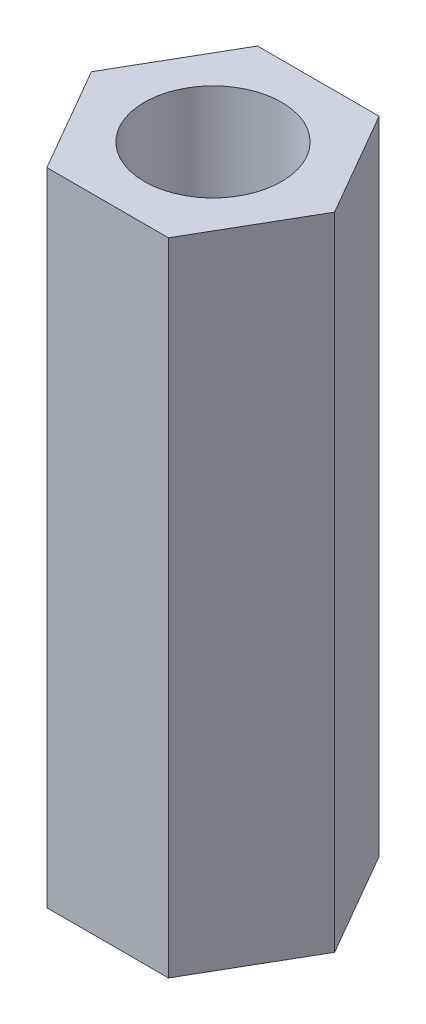
ISO-10303-21;
HEADER;
FILE_DESCRIPTION(('STEP AP214'),'2;1');
FILE_NAME('part.step','',(''),(''),'','','');
FILE_SCHEMA(('AUTOMOTIVE_DESIGN { 1 0 10303 214 1 1 1 1 }'));
ENDSEC;
DATA;
#1=APPLICATION_CONTEXT('core data for automotive mechanical design processes');
#2=APPLICATION_PROTOCOL_DEFINITION('international standard','automotive_design',2000,#1);
#3=PRODUCT_CONTEXT('',#1,'mechanical');
#4=PRODUCT('Part','Part','',(#3));
#5=PRODUCT_RELATED_PRODUCT_CATEGORY('part','',(#4));
#6=PRODUCT_DEFINITION_FORMATION('','',#4);
#7=PRODUCT_DEFINITION_CONTEXT('part definition',#1,'design');
#8=PRODUCT_DEFINITION('design','',#6,#7);
#9=PRODUCT_DEFINITION_SHAPE('','',#8);
#10=(LENGTH_UNIT() NAMED_UNIT(*) SI_UNIT(.MILLI.,.METRE.));
#11=(NAMED_UNIT(*) PLANE_ANGLE_UNIT() SI_UNIT($,.RADIAN.));
#12=(NAMED_UNIT(*) SI_UNIT($,.STERADIAN.) SOLID_ANGLE_UNIT());
#13=UNCERTAINTY_MEASURE_WITH_UNIT(LENGTH_MEASURE(1.E-05),#10,'distance_accuracy_value','');
#14=(GEOMETRIC_REPRESENTATION_CONTEXT(3) GLOBAL_UNCERTAINTY_ASSIGNED_CONTEXT((#13)) GLOBAL_UNIT_ASSIGNED_CONTEXT((#10,
#11,#12)) REPRESENTATION_CONTEXT('',''));
#15=CARTESIAN_POINT('',(0.,0.,0.));
#16=DIRECTION('',(0.,0.,1.));
#17=DIRECTION('',(1.,0.,0.));
#18=AXIS2_PLACEMENT_3D('',#15,#16,#17);
#19=CARTESIAN_POINT('',(1.32790561913617,14.,2.29999999999999));
#20=DIRECTION('',(-0.866025403784441,0.,-0.499999999999995));
#21=DIRECTION('',(-0.499999999999995,0.,0.866025403784441));
#22=AXIS2_PLACEMENT_3D('',#19,#20,#21);
#23=PLANE('',#22);
#24=DIRECTION('',(0.499999999999995,0.,-0.866025403784442));
#25=VECTOR('',#24,1.);
#26=CARTESIAN_POINT('',(1.32790561913617,0.,2.29999999999999));
#27=LINE('',#26,#25);
#28=CARTESIAN_POINT('',(1.32790561913617,0.,2.29999999999999));
#29=VERTEX_POINT('',#28);
#30=CARTESIAN_POINT('',(2.65581123827228,0.,0.));
#31=VERTEX_POINT('',#30);
#32=EDGE_CURVE('E123',#29,#31,#27,.T.);
#33=ORIENTED_EDGE('',*,*,#32,.T.);
#34=DIRECTION('',(0.,-1.,0.));
#35=VECTOR('',#34,1.);
#36=CARTESIAN_POINT('',(2.65581123827228,14.,0.));
#37=LINE('',#36,#35);
#38=CARTESIAN_POINT('',(2.65581123827228,14.,0.));
#39=VERTEX_POINT('',#38);
#40=EDGE_CURVE('E11',#39,#31,#37,.T.);
#41=ORIENTED_EDGE('',*,*,#40,.F.);
#42=DIRECTION('',(0.499999999999995,0.,-0.866025403784442));
#43=VECTOR('',#42,1.);
#44=CARTESIAN_POINT('',(1.32790561913617,14.,2.29999999999999));
#45=LINE('',#44,#43);
#46=CARTESIAN_POINT('',(1.32790561913617,14.,2.29999999999999));
#47=VERTEX_POINT('',#46);
#48=EDGE_CURVE('E134',#47,#39,#45,.T.);
#49=ORIENTED_EDGE('',*,*,#48,.F.);
#50=DIRECTION('',(0.,-1.,0.));
#51=VECTOR('',#50,1.);
#52=CARTESIAN_POINT('',(1.32790561913617,14.,2.29999999999999));
#53=LINE('',#52,#51);
#54=EDGE_CURVE('E119',#47,#29,#53,.T.);
#55=ORIENTED_EDGE('',*,*,#54,.T.);
#56=EDGE_LOOP('',(#33,#41,#49,#55));
#57=FACE_BOUND('',#56,.T.);
#58=ADVANCED_FACE('F39',(#57),#23,.F.);
#59=CARTESIAN_POINT('',(2.65581123827228,14.,0.));
#60=DIRECTION('',(-0.866025403784438,0.,0.500000000000001));
#61=DIRECTION('',(0.500000000000001,0.,0.866025403784438));
#62=AXIS2_PLACEMENT_3D('',#59,#60,#61);
#63=PLANE('',#62);
#64=DIRECTION('',(-0.500000000000001,0.,-0.866025403784438));
#65=VECTOR('',#64,1.);
#66=CARTESIAN_POINT('',(2.65581123827228,0.,0.));
#67=LINE('',#66,#65);
#68=CARTESIAN_POINT('',(1.32790561913613,0.,-2.3));
#69=VERTEX_POINT('',#68);
#70=EDGE_CURVE('E126',#31,#69,#67,.T.);
#71=ORIENTED_EDGE('',*,*,#70,.T.);
#72=DIRECTION('',(0.,-1.,0.));
#73=VECTOR('',#72,1.);
#74=CARTESIAN_POINT('',(1.32790561913613,14.,-2.3));
#75=LINE('',#74,#73);
#76=CARTESIAN_POINT('',(1.32790561913613,14.,-2.3));
#77=VERTEX_POINT('',#76);
#78=EDGE_CURVE('E47',#77,#69,#75,.T.);
#79=ORIENTED_EDGE('',*,*,#78,.F.);
#80=DIRECTION('',(-0.500000000000001,0.,-0.866025403784438));
#81=VECTOR('',#80,1.);
#82=CARTESIAN_POINT('',(2.65581123827228,14.,0.));
#83=LINE('',#82,#81);
#84=EDGE_CURVE('E92',#39,#77,#83,.T.);
#85=ORIENTED_EDGE('',*,*,#84,.F.);
#86=ORIENTED_EDGE('',*,*,#40,.T.);
#87=EDGE_LOOP('',(#71,#79,#85,#86));
#88=FACE_BOUND('',#87,.T.);
#89=ADVANCED_FACE('F159',(#88),#63,.F.);
#90=CARTESIAN_POINT('',(1.32790561913613,14.,-2.3));
#91=DIRECTION('',(0.,0.,1.));
#92=DIRECTION('',(1.,0.,0.));
#93=AXIS2_PLACEMENT_3D('',#90,#91,#92);
#94=PLANE('',#93);
#95=DIRECTION('',(-1.,0.,0.));
#96=VECTOR('',#95,1.);
#97=CARTESIAN_POINT('',(1.32790561913613,0.,-2.3));
#98=LINE('',#97,#96);
#99=CARTESIAN_POINT('',(-1.32790561913615,0.,-2.3));
#100=VERTEX_POINT('',#99);
#101=EDGE_CURVE('E129',#69,#100,#98,.T.);
#102=ORIENTED_EDGE('',*,*,#101,.T.);
#103=DIRECTION('',(0.,-1.,0.));
#104=VECTOR('',#103,1.);
#105=CARTESIAN_POINT('',(-1.32790561913615,14.,-2.3));
#106=LINE('',#105,#104);
#107=CARTESIAN_POINT('',(-1.32790561913615,14.,-2.3));
#108=VERTEX_POINT('',#107);
#109=EDGE_CURVE('E114',#108,#100,#106,.T.);
#110=ORIENTED_EDGE('',*,*,#109,.F.);
#111=DIRECTION('',(-1.,0.,0.));
#112=VECTOR('',#111,1.);
#113=CARTESIAN_POINT('',(1.32790561913613,14.,-2.3));
#114=LINE('',#113,#112);
#115=EDGE_CURVE('E105',#77,#108,#114,.T.);
#116=ORIENTED_EDGE('',*,*,#115,.F.);
#117=ORIENTED_EDGE('',*,*,#78,.T.);
#118=EDGE_LOOP('',(#102,#110,#116,#117));
#119=FACE_BOUND('',#118,.T.);
#120=ADVANCED_FACE('F140',(#119),#94,.F.);
#121=CARTESIAN_POINT('',(-1.32790561913615,14.,-2.3));
#122=DIRECTION('',(0.866025403784442,0.,0.499999999999995));
#123=DIRECTION('',(0.499999999999995,0.,-0.866025403784442));
#124=AXIS2_PLACEMENT_3D('',#121,#122,#123);
#125=PLANE('',#124);
#126=DIRECTION('',(-0.499999999999995,0.,0.866025403784442));
#127=VECTOR('',#126,1.);
#128=CARTESIAN_POINT('',(-1.32790561913615,0.,-2.3));
#129=LINE('',#128,#127);
#130=CARTESIAN_POINT('',(-2.65581123827228,0.,0.));
#131=VERTEX_POINT('',#130);
#132=EDGE_CURVE('E113',#100,#131,#129,.T.);
#133=ORIENTED_EDGE('',*,*,#132,.T.);
#134=DIRECTION('',(0.,-1.,0.));
#135=VECTOR('',#134,1.);
#136=CARTESIAN_POINT('',(-2.65581123827228,14.,0.));
#137=LINE('',#136,#135);
#138=CARTESIAN_POINT('',(-2.65581123827228,14.,0.));
#139=VERTEX_POINT('',#138);
#140=EDGE_CURVE('E110',#139,#131,#137,.T.);
#141=ORIENTED_EDGE('',*,*,#140,.F.);
#142=DIRECTION('',(-0.499999999999995,0.,0.866025403784442));
#143=VECTOR('',#142,1.);
#144=CARTESIAN_POINT('',(-1.32790561913615,14.,-2.3));
#145=LINE('',#144,#143);
#146=EDGE_CURVE('E99',#108,#139,#145,.T.);
#147=ORIENTED_EDGE('',*,*,#146,.F.);
#148=ORIENTED_EDGE('',*,*,#109,.T.);
#149=EDGE_LOOP('',(#133,#141,#147,#148));
#150=FACE_BOUND('',#149,.T.);
#151=ADVANCED_FACE('F111',(#150),#125,.F.);
#152=CARTESIAN_POINT('',(-2.65581123827228,14.,0.));
#153=DIRECTION('',(0.866025403784434,0.,-0.500000000000007));
#154=DIRECTION('',(-0.500000000000007,0.,-0.866025403784435));
#155=AXIS2_PLACEMENT_3D('',#152,#153,#154);
#156=PLANE('',#155);
#157=DIRECTION('',(0.500000000000007,0.,0.866025403784434));
#158=VECTOR('',#157,1.);
#159=CARTESIAN_POINT('',(-2.65581123827228,0.,0.));
#160=LINE('',#159,#158);
#161=CARTESIAN_POINT('',(-1.32790561913612,0.,2.30000000000001));
#162=VERTEX_POINT('',#161);
#163=EDGE_CURVE('E78',#131,#162,#160,.T.);
#164=ORIENTED_EDGE('',*,*,#163,.T.);
#165=DIRECTION('',(0.,-1.,0.));
#166=VECTOR('',#165,1.);
#167=CARTESIAN_POINT('',(-1.32790561913612,14.,2.30000000000001));
#168=LINE('',#167,#166);
#169=CARTESIAN_POINT('',(-1.32790561913612,14.,2.30000000000001));
#170=VERTEX_POINT('',#169);
#171=EDGE_CURVE('E115',#170,#162,#168,.T.);
#172=ORIENTED_EDGE('',*,*,#171,.F.);
#173=DIRECTION('',(0.500000000000007,0.,0.866025403784434));
#174=VECTOR('',#173,1.);
#175=CARTESIAN_POINT('',(-2.65581123827228,14.,0.));
#176=LINE('',#175,#174);
#177=EDGE_CURVE('E103',#139,#170,#176,.T.);
#178=ORIENTED_EDGE('',*,*,#177,.F.);
#179=ORIENTED_EDGE('',*,*,#140,.T.);
#180=EDGE_LOOP('',(#164,#172,#178,#179));
#181=FACE_BOUND('',#180,.T.);
#182=ADVANCED_FACE('F117',(#181),#156,.F.);
#183=CARTESIAN_POINT('',(-1.32790561913612,14.,2.30000000000001));
#184=DIRECTION('',(0.,0.,-1.));
#185=DIRECTION('',(-1.,0.,0.));
#186=AXIS2_PLACEMENT_3D('',#183,#184,#185);
#187=PLANE('',#186);
#188=DIRECTION('',(1.,0.,0.));
#189=VECTOR('',#188,1.);
#190=CARTESIAN_POINT('',(-1.32790561913612,0.,2.30000000000001));
#191=LINE('',#190,#189);
#192=EDGE_CURVE('E84',#162,#29,#191,.T.);
#193=ORIENTED_EDGE('',*,*,#192,.T.);
#194=ORIENTED_EDGE('',*,*,#54,.F.);
#195=DIRECTION('',(1.,0.,0.));
#196=VECTOR('',#195,1.);
#197=CARTESIAN_POINT('',(-1.32790561913612,14.,2.30000000000001));
#198=LINE('',#197,#196);
#199=EDGE_CURVE('E55',#170,#47,#198,.T.);
#200=ORIENTED_EDGE('',*,*,#199,.F.);
#201=ORIENTED_EDGE('',*,*,#171,.T.);
#202=EDGE_LOOP('',(#193,#194,#200,#201));
#203=FACE_BOUND('',#202,.T.);
#204=ADVANCED_FACE('F147',(#203),#187,.F.);
#205=CARTESIAN_POINT('',(0.,14.,0.));
#206=DIRECTION('',(0.,1.,0.));
#207=DIRECTION('',(0.,0.,1.));
#208=AXIS2_PLACEMENT_3D('',#205,#206,#207);
#209=PLANE('',#208);
#210=CARTESIAN_POINT('',(0.,14.,0.));
#211=DIRECTION('',(0.,1.,0.));
#212=DIRECTION('',(0.,0.,1.));
#213=AXIS2_PLACEMENT_3D('',#210,#211,#212);
#214=CIRCLE('',#213,1.50000000000001);
#215=CARTESIAN_POINT('',(0.,14.,1.50000000000001));
#216=VERTEX_POINT('',#215);
#217=EDGE_CURVE('E215',#216,#216,#214,.T.);
#218=ORIENTED_EDGE('',*,*,#217,.F.);
#219=EDGE_LOOP('',(#218));
#220=FACE_BOUND('',#219,.T.);
#221=ORIENTED_EDGE('',*,*,#48,.T.);
#222=ORIENTED_EDGE('',*,*,#84,.T.);
#223=ORIENTED_EDGE('',*,*,#115,.T.);
#224=ORIENTED_EDGE('',*,*,#146,.T.);
#225=ORIENTED_EDGE('',*,*,#177,.T.);
#226=ORIENTED_EDGE('',*,*,#199,.T.);
#227=EDGE_LOOP('',(#221,#222,#223,#224,#225,#226));
#228=FACE_BOUND('',#227,.T.);
#229=ADVANCED_FACE('F101',(#220,#228),#209,.T.);
#230=CARTESIAN_POINT('',(0.,0.,0.));
#231=DIRECTION('',(0.,1.,0.));
#232=DIRECTION('',(0.,0.,1.));
#233=AXIS2_PLACEMENT_3D('',#230,#231,#232);
#234=PLANE('',#233);
#235=CARTESIAN_POINT('',(0.,0.,0.));
#236=DIRECTION('',(0.,1.,0.));
#237=DIRECTION('',(0.,0.,1.));
#238=AXIS2_PLACEMENT_3D('',#235,#236,#237);
#239=CIRCLE('',#238,1.50000000000001);
#240=CARTESIAN_POINT('',(0.,0.,1.50000000000001));
#241=VERTEX_POINT('',#240);
#242=EDGE_CURVE('E127',#241,#241,#239,.T.);
#243=ORIENTED_EDGE('',*,*,#242,.T.);
#244=EDGE_LOOP('',(#243));
#245=FACE_BOUND('',#244,.T.);
#246=ORIENTED_EDGE('',*,*,#32,.F.);
#247=ORIENTED_EDGE('',*,*,#192,.F.);
#248=ORIENTED_EDGE('',*,*,#163,.F.);
#249=ORIENTED_EDGE('',*,*,#132,.F.);
#250=ORIENTED_EDGE('',*,*,#101,.F.);
#251=ORIENTED_EDGE('',*,*,#70,.F.);
#252=EDGE_LOOP('',(#246,#247,#248,#249,#250,#251));
#253=FACE_BOUND('',#252,.T.);
#254=ADVANCED_FACE('F143',(#245,#253),#234,.F.);
#255=CARTESIAN_POINT('',(0.,14.,0.));
#256=DIRECTION('',(0.,1.,0.));
#257=DIRECTION('',(0.,0.,1.));
#258=AXIS2_PLACEMENT_3D('',#255,#256,#257);
#259=CYLINDRICAL_SURFACE('',#258,1.50000000000001);
#260=ORIENTED_EDGE('',*,*,#242,.F.);
#261=EDGE_LOOP('',(#260));
#262=FACE_BOUND('',#261,.T.);
#263=ORIENTED_EDGE('',*,*,#217,.T.);
#264=EDGE_LOOP('',(#263));
#265=FACE_BOUND('',#264,.T.);
#266=ADVANCED_FACE('F198',(#262,#265),#259,.F.);
#267=CLOSED_SHELL('',(#58,#89,#120,#151,#182,#204,#229,#254,#266));
#268=MANIFOLD_SOLID_BREP('B2',#267);
#269=ADVANCED_BREP_SHAPE_REPRESENTATION('',(#18,#268),#14);
#270=SHAPE_DEFINITION_REPRESENTATION(#9,#269);
ENDSEC;
END-ISO-10303-21;
